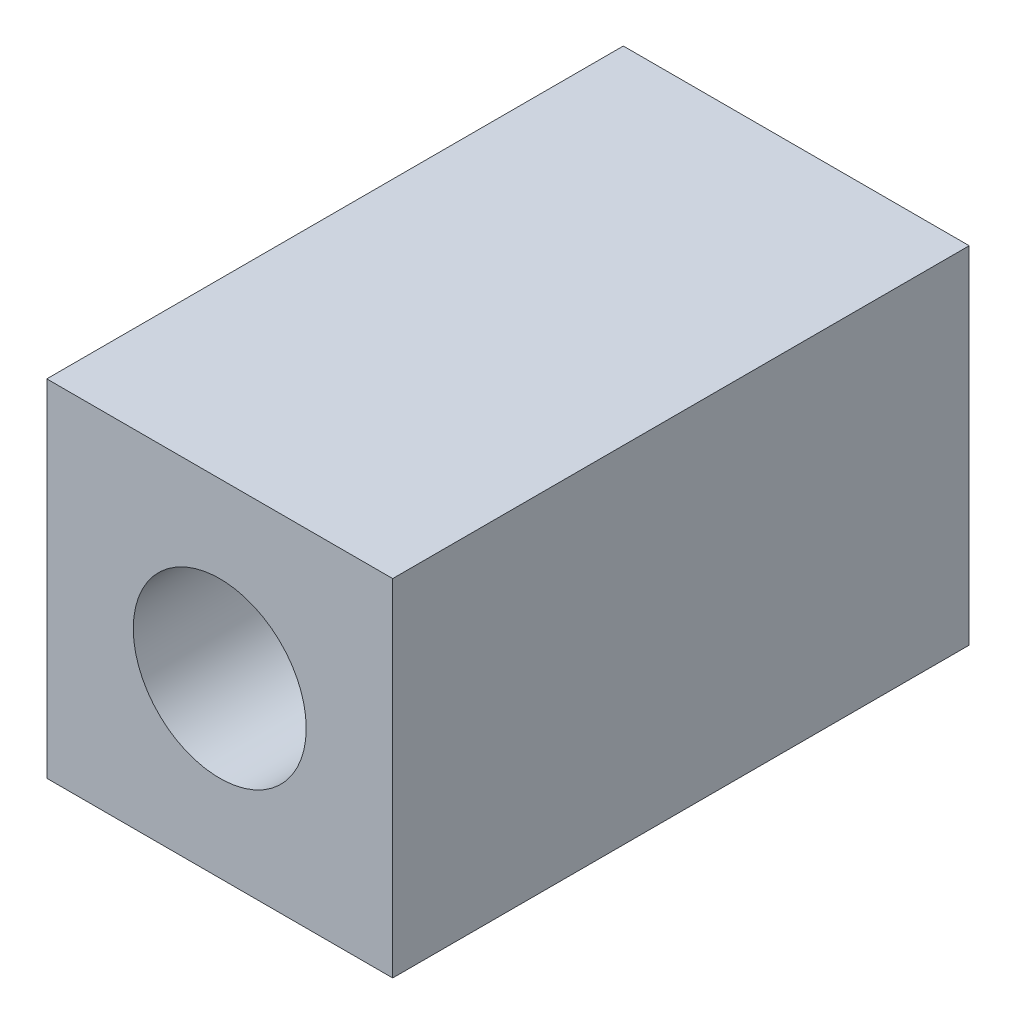
ISO-10303-21;
HEADER;
FILE_DESCRIPTION(('STEP AP214'),'2;1');
FILE_NAME('part.step','',(''),(''),'','','');
FILE_SCHEMA(('AUTOMOTIVE_DESIGN { 1 0 10303 214 1 1 1 1 }'));
ENDSEC;
DATA;
#1=APPLICATION_CONTEXT('core data for automotive mechanical design processes');
#2=APPLICATION_PROTOCOL_DEFINITION('international standard','automotive_design',2000,#1);
#3=PRODUCT_CONTEXT('',#1,'mechanical');
#4=PRODUCT('Part','Part','',(#3));
#5=PRODUCT_RELATED_PRODUCT_CATEGORY('part','',(#4));
#6=PRODUCT_DEFINITION_FORMATION('','',#4);
#7=PRODUCT_DEFINITION_CONTEXT('part definition',#1,'design');
#8=PRODUCT_DEFINITION('design','',#6,#7);
#9=PRODUCT_DEFINITION_SHAPE('','',#8);
#10=(LENGTH_UNIT() NAMED_UNIT(*) SI_UNIT(.MILLI.,.METRE.));
#11=(NAMED_UNIT(*) PLANE_ANGLE_UNIT() SI_UNIT($,.RADIAN.));
#12=(NAMED_UNIT(*) SI_UNIT($,.STERADIAN.) SOLID_ANGLE_UNIT());
#13=UNCERTAINTY_MEASURE_WITH_UNIT(LENGTH_MEASURE(1.E-05),#10,'distance_accuracy_value','');
#14=(GEOMETRIC_REPRESENTATION_CONTEXT(3) GLOBAL_UNCERTAINTY_ASSIGNED_CONTEXT((#13)) GLOBAL_UNIT_ASSIGNED_CONTEXT((#10,
#11,#12)) REPRESENTATION_CONTEXT('',''));
#15=CARTESIAN_POINT('',(0.,0.,0.));
#16=DIRECTION('',(0.,0.,1.));
#17=DIRECTION('',(1.,0.,0.));
#18=AXIS2_PLACEMENT_3D('',#15,#16,#17);
#19=CARTESIAN_POINT('',(0.,0.,10.));
#20=DIRECTION('',(0.,0.,1.));
#21=DIRECTION('',(1.,0.,0.));
#22=AXIS2_PLACEMENT_3D('',#19,#20,#21);
#23=PLANE('',#22);
#24=DIRECTION('',(0.,-1.,0.));
#25=VECTOR('',#24,1.);
#26=CARTESIAN_POINT('',(-7.61904761904761,4.88888888888889,10.));
#27=LINE('',#26,#25);
#28=CARTESIAN_POINT('',(-7.61904761904761,4.88888888888889,10.));
#29=VERTEX_POINT('',#28);
#30=CARTESIAN_POINT('',(-7.61904761904761,-1.11111111111111,10.));
#31=VERTEX_POINT('',#30);
#32=EDGE_CURVE('E85',#29,#31,#27,.T.);
#33=ORIENTED_EDGE('',*,*,#32,.T.);
#34=DIRECTION('',(1.,0.,0.));
#35=VECTOR('',#34,1.);
#36=CARTESIAN_POINT('',(-7.61904761904761,-1.11111111111111,10.));
#37=LINE('',#36,#35);
#38=CARTESIAN_POINT('',(-1.61904761904761,-1.11111111111111,10.));
#39=VERTEX_POINT('',#38);
#40=EDGE_CURVE('E80',#31,#39,#37,.T.);
#41=ORIENTED_EDGE('',*,*,#40,.T.);
#42=DIRECTION('',(0.,1.,0.));
#43=VECTOR('',#42,1.);
#44=CARTESIAN_POINT('',(-1.61904761904761,4.88888888888889,10.));
#45=LINE('',#44,#43);
#46=CARTESIAN_POINT('',(-1.61904761904761,4.88888888888889,10.));
#47=VERTEX_POINT('',#46);
#48=EDGE_CURVE('E83',#39,#47,#45,.T.);
#49=ORIENTED_EDGE('',*,*,#48,.T.);
#50=DIRECTION('',(-1.,0.,0.));
#51=VECTOR('',#50,1.);
#52=CARTESIAN_POINT('',(-7.61904761904761,4.88888888888889,10.));
#53=LINE('',#52,#51);
#54=EDGE_CURVE('E50',#47,#29,#53,.T.);
#55=ORIENTED_EDGE('',*,*,#54,.T.);
#56=EDGE_LOOP('',(#33,#41,#49,#55));
#57=FACE_BOUND('',#56,.T.);
#58=CARTESIAN_POINT('',(-4.61904761904761,1.88888888888889,10.));
#59=DIRECTION('',(0.,0.,1.));
#60=DIRECTION('',(1.,0.,0.));
#61=AXIS2_PLACEMENT_3D('',#58,#59,#60);
#62=CIRCLE('',#61,1.5);
#63=CARTESIAN_POINT('',(-3.11904761904761,1.88888888888889,10.));
#64=VERTEX_POINT('',#63);
#65=EDGE_CURVE('E100',#64,#64,#62,.T.);
#66=ORIENTED_EDGE('',*,*,#65,.F.);
#67=EDGE_LOOP('',(#66));
#68=FACE_BOUND('',#67,.T.);
#69=ADVANCED_FACE('F33',(#57,#68),#23,.T.);
#70=CARTESIAN_POINT('',(0.,0.,0.));
#71=DIRECTION('',(0.,0.,1.));
#72=DIRECTION('',(1.,0.,0.));
#73=AXIS2_PLACEMENT_3D('',#70,#71,#72);
#74=PLANE('',#73);
#75=DIRECTION('',(0.,-1.,0.));
#76=VECTOR('',#75,1.);
#77=CARTESIAN_POINT('',(-7.61904761904761,4.88888888888889,0.));
#78=LINE('',#77,#76);
#79=CARTESIAN_POINT('',(-7.61904761904761,4.88888888888889,0.));
#80=VERTEX_POINT('',#79);
#81=CARTESIAN_POINT('',(-7.61904761904761,-1.11111111111111,0.));
#82=VERTEX_POINT('',#81);
#83=EDGE_CURVE('E97',#80,#82,#78,.T.);
#84=ORIENTED_EDGE('',*,*,#83,.F.);
#85=DIRECTION('',(-1.,0.,0.));
#86=VECTOR('',#85,1.);
#87=CARTESIAN_POINT('',(-7.61904761904761,4.88888888888889,0.));
#88=LINE('',#87,#86);
#89=CARTESIAN_POINT('',(-1.61904761904761,4.88888888888889,0.));
#90=VERTEX_POINT('',#89);
#91=EDGE_CURVE('E73',#90,#80,#88,.T.);
#92=ORIENTED_EDGE('',*,*,#91,.F.);
#93=DIRECTION('',(0.,1.,0.));
#94=VECTOR('',#93,1.);
#95=CARTESIAN_POINT('',(-1.61904761904761,4.88888888888889,0.));
#96=LINE('',#95,#94);
#97=CARTESIAN_POINT('',(-1.61904761904761,-1.11111111111111,0.));
#98=VERTEX_POINT('',#97);
#99=EDGE_CURVE('E67',#98,#90,#96,.T.);
#100=ORIENTED_EDGE('',*,*,#99,.F.);
#101=DIRECTION('',(1.,0.,0.));
#102=VECTOR('',#101,1.);
#103=CARTESIAN_POINT('',(-7.61904761904761,-1.11111111111111,0.));
#104=LINE('',#103,#102);
#105=EDGE_CURVE('E89',#82,#98,#104,.T.);
#106=ORIENTED_EDGE('',*,*,#105,.F.);
#107=EDGE_LOOP('',(#84,#92,#100,#106));
#108=FACE_BOUND('',#107,.T.);
#109=CARTESIAN_POINT('',(-4.61904761904761,1.88888888888889,0.));
#110=DIRECTION('',(0.,0.,1.));
#111=DIRECTION('',(1.,0.,0.));
#112=AXIS2_PLACEMENT_3D('',#109,#110,#111);
#113=CIRCLE('',#112,1.5);
#114=CARTESIAN_POINT('',(-3.11904761904761,1.88888888888889,0.));
#115=VERTEX_POINT('',#114);
#116=EDGE_CURVE('E112',#115,#115,#113,.T.);
#117=ORIENTED_EDGE('',*,*,#116,.T.);
#118=EDGE_LOOP('',(#117));
#119=FACE_BOUND('',#118,.T.);
#120=ADVANCED_FACE('F108',(#108,#119),#74,.F.);
#121=CARTESIAN_POINT('',(-7.61904761904761,4.88888888888889,10.));
#122=DIRECTION('',(1.,0.,0.));
#123=DIRECTION('',(0.,1.,0.));
#124=AXIS2_PLACEMENT_3D('',#121,#122,#123);
#125=PLANE('',#124);
#126=ORIENTED_EDGE('',*,*,#83,.T.);
#127=DIRECTION('',(0.,0.,-1.));
#128=VECTOR('',#127,1.);
#129=CARTESIAN_POINT('',(-7.61904761904761,-1.11111111111111,10.));
#130=LINE('',#129,#128);
#131=EDGE_CURVE('E11',#31,#82,#130,.T.);
#132=ORIENTED_EDGE('',*,*,#131,.F.);
#133=ORIENTED_EDGE('',*,*,#32,.F.);
#134=DIRECTION('',(0.,0.,-1.));
#135=VECTOR('',#134,1.);
#136=CARTESIAN_POINT('',(-7.61904761904761,4.88888888888889,10.));
#137=LINE('',#136,#135);
#138=EDGE_CURVE('E93',#29,#80,#137,.T.);
#139=ORIENTED_EDGE('',*,*,#138,.T.);
#140=EDGE_LOOP('',(#126,#132,#133,#139));
#141=FACE_BOUND('',#140,.T.);
#142=ADVANCED_FACE('F35',(#141),#125,.F.);
#143=CARTESIAN_POINT('',(-7.61904761904761,-1.11111111111111,10.));
#144=DIRECTION('',(0.,1.,0.));
#145=DIRECTION('',(0.,0.,1.));
#146=AXIS2_PLACEMENT_3D('',#143,#144,#145);
#147=PLANE('',#146);
#148=ORIENTED_EDGE('',*,*,#105,.T.);
#149=DIRECTION('',(0.,0.,-1.));
#150=VECTOR('',#149,1.);
#151=CARTESIAN_POINT('',(-1.61904761904761,-1.11111111111111,10.));
#152=LINE('',#151,#150);
#153=EDGE_CURVE('E42',#39,#98,#152,.T.);
#154=ORIENTED_EDGE('',*,*,#153,.F.);
#155=ORIENTED_EDGE('',*,*,#40,.F.);
#156=ORIENTED_EDGE('',*,*,#131,.T.);
#157=EDGE_LOOP('',(#148,#154,#155,#156));
#158=FACE_BOUND('',#157,.T.);
#159=ADVANCED_FACE('F88',(#158),#147,.F.);
#160=CARTESIAN_POINT('',(-1.61904761904761,4.88888888888889,10.));
#161=DIRECTION('',(-1.,0.,0.));
#162=DIRECTION('',(0.,-1.,0.));
#163=AXIS2_PLACEMENT_3D('',#160,#161,#162);
#164=PLANE('',#163);
#165=ORIENTED_EDGE('',*,*,#99,.T.);
#166=DIRECTION('',(0.,0.,-1.));
#167=VECTOR('',#166,1.);
#168=CARTESIAN_POINT('',(-1.61904761904761,4.88888888888889,10.));
#169=LINE('',#168,#167);
#170=EDGE_CURVE('E90',#47,#90,#169,.T.);
#171=ORIENTED_EDGE('',*,*,#170,.F.);
#172=ORIENTED_EDGE('',*,*,#48,.F.);
#173=ORIENTED_EDGE('',*,*,#153,.T.);
#174=EDGE_LOOP('',(#165,#171,#172,#173));
#175=FACE_BOUND('',#174,.T.);
#176=ADVANCED_FACE('F91',(#175),#164,.F.);
#177=CARTESIAN_POINT('',(-7.61904761904761,4.88888888888889,10.));
#178=DIRECTION('',(0.,-1.,0.));
#179=DIRECTION('',(0.,0.,-1.));
#180=AXIS2_PLACEMENT_3D('',#177,#178,#179);
#181=PLANE('',#180);
#182=ORIENTED_EDGE('',*,*,#91,.T.);
#183=ORIENTED_EDGE('',*,*,#138,.F.);
#184=ORIENTED_EDGE('',*,*,#54,.F.);
#185=ORIENTED_EDGE('',*,*,#170,.T.);
#186=EDGE_LOOP('',(#182,#183,#184,#185));
#187=FACE_BOUND('',#186,.T.);
#188=ADVANCED_FACE('F105',(#187),#181,.F.);
#189=CARTESIAN_POINT('',(-4.61904761904761,1.88888888888889,10.));
#190=DIRECTION('',(0.,0.,-1.));
#191=DIRECTION('',(-1.,0.,0.));
#192=AXIS2_PLACEMENT_3D('',#189,#190,#191);
#193=CYLINDRICAL_SURFACE('',#192,1.5);
#194=ORIENTED_EDGE('',*,*,#65,.T.);
#195=EDGE_LOOP('',(#194));
#196=FACE_BOUND('',#195,.T.);
#197=ORIENTED_EDGE('',*,*,#116,.F.);
#198=EDGE_LOOP('',(#197));
#199=FACE_BOUND('',#198,.T.);
#200=ADVANCED_FACE('F118',(#196,#199),#193,.F.);
#201=CLOSED_SHELL('',(#69,#120,#142,#159,#176,#188,#200));
#202=MANIFOLD_SOLID_BREP('B2',#201);
#203=ADVANCED_BREP_SHAPE_REPRESENTATION('',(#18,#202),#14);
#204=SHAPE_DEFINITION_REPRESENTATION(#9,#203);
ENDSEC;
END-ISO-10303-21;
